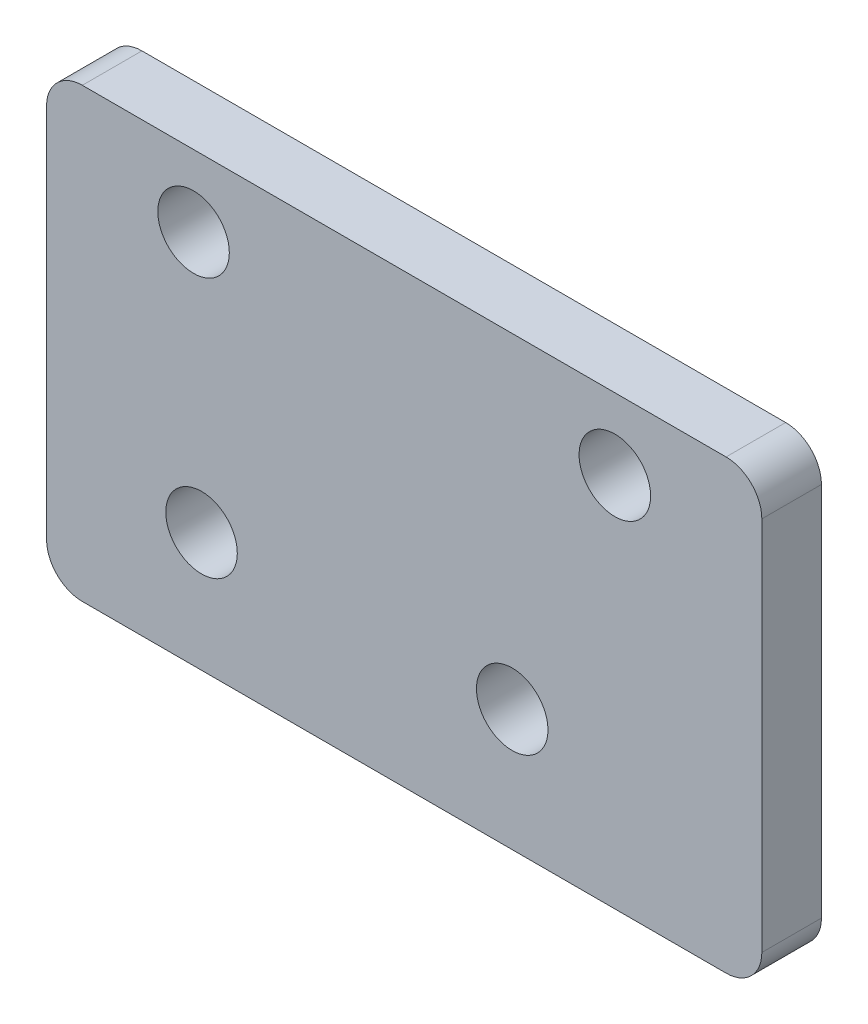
ISO-10303-21;
HEADER;
FILE_DESCRIPTION(('STEP AP214'),'2;1');
FILE_NAME('part.step','',(''),(''),'','','');
FILE_SCHEMA(('AUTOMOTIVE_DESIGN { 1 0 10303 214 1 1 1 1 }'));
ENDSEC;
DATA;
#1=APPLICATION_CONTEXT('core data for automotive mechanical design processes');
#2=APPLICATION_PROTOCOL_DEFINITION('international standard','automotive_design',2000,#1);
#3=PRODUCT_CONTEXT('',#1,'mechanical');
#4=PRODUCT('Part','Part','',(#3));
#5=PRODUCT_RELATED_PRODUCT_CATEGORY('part','',(#4));
#6=PRODUCT_DEFINITION_FORMATION('','',#4);
#7=PRODUCT_DEFINITION_CONTEXT('part definition',#1,'design');
#8=PRODUCT_DEFINITION('design','',#6,#7);
#9=PRODUCT_DEFINITION_SHAPE('','',#8);
#10=(LENGTH_UNIT() NAMED_UNIT(*) SI_UNIT(.MILLI.,.METRE.));
#11=(NAMED_UNIT(*) PLANE_ANGLE_UNIT() SI_UNIT($,.RADIAN.));
#12=(NAMED_UNIT(*) SI_UNIT($,.STERADIAN.) SOLID_ANGLE_UNIT());
#13=UNCERTAINTY_MEASURE_WITH_UNIT(LENGTH_MEASURE(1.E-05),#10,'distance_accuracy_value','');
#14=(GEOMETRIC_REPRESENTATION_CONTEXT(3) GLOBAL_UNCERTAINTY_ASSIGNED_CONTEXT((#13)) GLOBAL_UNIT_ASSIGNED_CONTEXT((#10,
#11,#12)) REPRESENTATION_CONTEXT('',''));
#15=CARTESIAN_POINT('',(0.,0.,0.));
#16=DIRECTION('',(0.,0.,1.));
#17=DIRECTION('',(1.,0.,0.));
#18=AXIS2_PLACEMENT_3D('',#15,#16,#17);
#19=CARTESIAN_POINT('',(38.5,-6.99999999999999,5.));
#20=DIRECTION('',(0.,0.,-1.));
#21=DIRECTION('',(-1.,0.,0.));
#22=AXIS2_PLACEMENT_3D('',#19,#20,#21);
#23=CYLINDRICAL_SURFACE('',#22,3.);
#24=CARTESIAN_POINT('',(38.5,-6.99999999999999,0.));
#25=DIRECTION('',(0.,0.,1.));
#26=DIRECTION('',(1.,0.,0.));
#27=AXIS2_PLACEMENT_3D('',#24,#25,#26);
#28=CIRCLE('',#27,3.);
#29=CARTESIAN_POINT('',(38.5,-9.99999999999999,0.));
#30=VERTEX_POINT('',#29);
#31=CARTESIAN_POINT('',(41.5,-6.99999999999997,0.));
#32=VERTEX_POINT('',#31);
#33=EDGE_CURVE('E139',#30,#32,#28,.T.);
#34=ORIENTED_EDGE('',*,*,#33,.T.);
#35=DIRECTION('',(0.,0.,-1.));
#36=VECTOR('',#35,1.);
#37=CARTESIAN_POINT('',(41.5,-6.99999999999997,5.));
#38=LINE('',#37,#36);
#39=CARTESIAN_POINT('',(41.5,-6.99999999999997,5.));
#40=VERTEX_POINT('',#39);
#41=EDGE_CURVE('E49',#40,#32,#38,.T.);
#42=ORIENTED_EDGE('',*,*,#41,.F.);
#43=CARTESIAN_POINT('',(38.5,-6.99999999999999,5.));
#44=DIRECTION('',(0.,0.,1.));
#45=DIRECTION('',(1.,0.,0.));
#46=AXIS2_PLACEMENT_3D('',#43,#44,#45);
#47=CIRCLE('',#46,3.);
#48=CARTESIAN_POINT('',(38.5,-9.99999999999999,5.));
#49=VERTEX_POINT('',#48);
#50=EDGE_CURVE('E186',#49,#40,#47,.T.);
#51=ORIENTED_EDGE('',*,*,#50,.F.);
#52=DIRECTION('',(0.,0.,-1.));
#53=VECTOR('',#52,1.);
#54=CARTESIAN_POINT('',(38.5,-9.99999999999999,5.));
#55=LINE('',#54,#53);
#56=EDGE_CURVE('E11',#49,#30,#55,.T.);
#57=ORIENTED_EDGE('',*,*,#56,.T.);
#58=EDGE_LOOP('',(#34,#42,#51,#57));
#59=FACE_BOUND('',#58,.T.);
#60=ADVANCED_FACE('F41',(#59),#23,.T.);
#61=CARTESIAN_POINT('',(41.5,24.5,5.));
#62=DIRECTION('',(-1.,0.,0.));
#63=DIRECTION('',(0.,-1.,0.));
#64=AXIS2_PLACEMENT_3D('',#61,#62,#63);
#65=PLANE('',#64);
#66=DIRECTION('',(0.,1.,0.));
#67=VECTOR('',#66,1.);
#68=CARTESIAN_POINT('',(41.5,24.5,0.));
#69=LINE('',#68,#67);
#70=CARTESIAN_POINT('',(41.5,24.5,0.));
#71=VERTEX_POINT('',#70);
#72=EDGE_CURVE('E145',#32,#71,#69,.T.);
#73=ORIENTED_EDGE('',*,*,#72,.T.);
#74=DIRECTION('',(0.,0.,-1.));
#75=VECTOR('',#74,1.);
#76=CARTESIAN_POINT('',(41.5,24.5,5.));
#77=LINE('',#76,#75);
#78=CARTESIAN_POINT('',(41.5,24.5,5.));
#79=VERTEX_POINT('',#78);
#80=EDGE_CURVE('E159',#79,#71,#77,.T.);
#81=ORIENTED_EDGE('',*,*,#80,.F.);
#82=DIRECTION('',(0.,1.,0.));
#83=VECTOR('',#82,1.);
#84=CARTESIAN_POINT('',(41.5,24.5,5.));
#85=LINE('',#84,#83);
#86=EDGE_CURVE('E194',#40,#79,#85,.T.);
#87=ORIENTED_EDGE('',*,*,#86,.F.);
#88=ORIENTED_EDGE('',*,*,#41,.T.);
#89=EDGE_LOOP('',(#73,#81,#87,#88));
#90=FACE_BOUND('',#89,.T.);
#91=ADVANCED_FACE('F213',(#90),#65,.F.);
#92=CARTESIAN_POINT('',(38.5,24.5,5.));
#93=DIRECTION('',(0.,0.,-1.));
#94=DIRECTION('',(-1.,0.,0.));
#95=AXIS2_PLACEMENT_3D('',#92,#93,#94);
#96=CYLINDRICAL_SURFACE('',#95,3.);
#97=CARTESIAN_POINT('',(38.5,24.5,0.));
#98=DIRECTION('',(0.,0.,1.));
#99=DIRECTION('',(-1.,0.,0.));
#100=AXIS2_PLACEMENT_3D('',#97,#98,#99);
#101=CIRCLE('',#100,3.);
#102=CARTESIAN_POINT('',(38.5,27.5,0.));
#103=VERTEX_POINT('',#102);
#104=EDGE_CURVE('E143',#71,#103,#101,.T.);
#105=ORIENTED_EDGE('',*,*,#104,.T.);
#106=DIRECTION('',(0.,0.,-1.));
#107=VECTOR('',#106,1.);
#108=CARTESIAN_POINT('',(38.5,27.5,5.));
#109=LINE('',#108,#107);
#110=CARTESIAN_POINT('',(38.5,27.5,5.));
#111=VERTEX_POINT('',#110);
#112=EDGE_CURVE('E160',#111,#103,#109,.T.);
#113=ORIENTED_EDGE('',*,*,#112,.F.);
#114=CARTESIAN_POINT('',(38.5,24.5,5.));
#115=DIRECTION('',(0.,0.,1.));
#116=DIRECTION('',(-1.,0.,0.));
#117=AXIS2_PLACEMENT_3D('',#114,#115,#116);
#118=CIRCLE('',#117,3.);
#119=EDGE_CURVE('E195',#79,#111,#118,.T.);
#120=ORIENTED_EDGE('',*,*,#119,.F.);
#121=ORIENTED_EDGE('',*,*,#80,.T.);
#122=EDGE_LOOP('',(#105,#113,#120,#121));
#123=FACE_BOUND('',#122,.T.);
#124=ADVANCED_FACE('F199',(#123),#96,.T.);
#125=CARTESIAN_POINT('',(-15.5,27.5,5.));
#126=DIRECTION('',(0.,-1.,0.));
#127=DIRECTION('',(1.,0.,0.));
#128=AXIS2_PLACEMENT_3D('',#125,#126,#127);
#129=PLANE('',#128);
#130=DIRECTION('',(-1.,0.,0.));
#131=VECTOR('',#130,1.);
#132=CARTESIAN_POINT('',(-15.5,27.5,0.));
#133=LINE('',#132,#131);
#134=CARTESIAN_POINT('',(-15.5,27.5,0.));
#135=VERTEX_POINT('',#134);
#136=EDGE_CURVE('E146',#103,#135,#133,.T.);
#137=ORIENTED_EDGE('',*,*,#136,.T.);
#138=DIRECTION('',(0.,0.,-1.));
#139=VECTOR('',#138,1.);
#140=CARTESIAN_POINT('',(-15.5,27.5,5.));
#141=LINE('',#140,#139);
#142=CARTESIAN_POINT('',(-15.5,27.5,5.));
#143=VERTEX_POINT('',#142);
#144=EDGE_CURVE('E128',#143,#135,#141,.T.);
#145=ORIENTED_EDGE('',*,*,#144,.F.);
#146=DIRECTION('',(-1.,0.,0.));
#147=VECTOR('',#146,1.);
#148=CARTESIAN_POINT('',(-15.5,27.5,5.));
#149=LINE('',#148,#147);
#150=EDGE_CURVE('E119',#111,#143,#149,.T.);
#151=ORIENTED_EDGE('',*,*,#150,.F.);
#152=ORIENTED_EDGE('',*,*,#112,.T.);
#153=EDGE_LOOP('',(#137,#145,#151,#152));
#154=FACE_BOUND('',#153,.T.);
#155=ADVANCED_FACE('F203',(#154),#129,.F.);
#156=CARTESIAN_POINT('',(-15.5,24.5,5.));
#157=DIRECTION('',(0.,0.,-1.));
#158=DIRECTION('',(-1.,0.,0.));
#159=AXIS2_PLACEMENT_3D('',#156,#157,#158);
#160=CYLINDRICAL_SURFACE('',#159,3.);
#161=CARTESIAN_POINT('',(-15.5,24.5,0.));
#162=DIRECTION('',(0.,0.,1.));
#163=DIRECTION('',(1.,0.,0.));
#164=AXIS2_PLACEMENT_3D('',#161,#162,#163);
#165=CIRCLE('',#164,3.);
#166=CARTESIAN_POINT('',(-18.5,24.5,0.));
#167=VERTEX_POINT('',#166);
#168=EDGE_CURVE('E130',#135,#167,#165,.T.);
#169=ORIENTED_EDGE('',*,*,#168,.T.);
#170=DIRECTION('',(0.,0.,-1.));
#171=VECTOR('',#170,1.);
#172=CARTESIAN_POINT('',(-18.5,24.5,5.));
#173=LINE('',#172,#171);
#174=CARTESIAN_POINT('',(-18.5,24.5,5.));
#175=VERTEX_POINT('',#174);
#176=EDGE_CURVE('E123',#175,#167,#173,.T.);
#177=ORIENTED_EDGE('',*,*,#176,.F.);
#178=CARTESIAN_POINT('',(-15.5,24.5,5.));
#179=DIRECTION('',(0.,0.,1.));
#180=DIRECTION('',(1.,0.,0.));
#181=AXIS2_PLACEMENT_3D('',#178,#179,#180);
#182=CIRCLE('',#181,3.);
#183=EDGE_CURVE('E112',#143,#175,#182,.T.);
#184=ORIENTED_EDGE('',*,*,#183,.F.);
#185=ORIENTED_EDGE('',*,*,#144,.T.);
#186=EDGE_LOOP('',(#169,#177,#184,#185));
#187=FACE_BOUND('',#186,.T.);
#188=ADVANCED_FACE('F129',(#187),#160,.T.);
#189=CARTESIAN_POINT('',(-18.5,24.5,5.));
#190=DIRECTION('',(1.,0.,0.));
#191=DIRECTION('',(0.,1.,0.));
#192=AXIS2_PLACEMENT_3D('',#189,#190,#191);
#193=PLANE('',#192);
#194=DIRECTION('',(0.,-1.,0.));
#195=VECTOR('',#194,1.);
#196=CARTESIAN_POINT('',(-18.5,24.5,0.));
#197=LINE('',#196,#195);
#198=CARTESIAN_POINT('',(-18.5,-6.99999999999998,0.));
#199=VERTEX_POINT('',#198);
#200=EDGE_CURVE('E89',#167,#199,#197,.T.);
#201=ORIENTED_EDGE('',*,*,#200,.T.);
#202=DIRECTION('',(0.,0.,-1.));
#203=VECTOR('',#202,1.);
#204=CARTESIAN_POINT('',(-18.5,-6.99999999999998,5.));
#205=LINE('',#204,#203);
#206=CARTESIAN_POINT('',(-18.5,-6.99999999999998,5.));
#207=VERTEX_POINT('',#206);
#208=EDGE_CURVE('E127',#207,#199,#205,.T.);
#209=ORIENTED_EDGE('',*,*,#208,.F.);
#210=DIRECTION('',(0.,-1.,0.));
#211=VECTOR('',#210,1.);
#212=CARTESIAN_POINT('',(-18.5,24.5,5.));
#213=LINE('',#212,#211);
#214=EDGE_CURVE('E117',#175,#207,#213,.T.);
#215=ORIENTED_EDGE('',*,*,#214,.F.);
#216=ORIENTED_EDGE('',*,*,#176,.T.);
#217=EDGE_LOOP('',(#201,#209,#215,#216));
#218=FACE_BOUND('',#217,.T.);
#219=ADVANCED_FACE('F135',(#218),#193,.F.);
#220=CARTESIAN_POINT('',(-15.5,-7.,5.));
#221=DIRECTION('',(0.,0.,-1.));
#222=DIRECTION('',(-1.,0.,0.));
#223=AXIS2_PLACEMENT_3D('',#220,#221,#222);
#224=CYLINDRICAL_SURFACE('',#223,3.);
#225=CARTESIAN_POINT('',(-15.5,-7.,0.));
#226=DIRECTION('',(0.,0.,1.));
#227=DIRECTION('',(1.,0.,0.));
#228=AXIS2_PLACEMENT_3D('',#225,#226,#227);
#229=CIRCLE('',#228,3.);
#230=CARTESIAN_POINT('',(-15.5,-10.,0.));
#231=VERTEX_POINT('',#230);
#232=EDGE_CURVE('E152',#199,#231,#229,.T.);
#233=ORIENTED_EDGE('',*,*,#232,.T.);
#234=DIRECTION('',(0.,0.,-1.));
#235=VECTOR('',#234,1.);
#236=CARTESIAN_POINT('',(-15.5,-10.,5.));
#237=LINE('',#236,#235);
#238=CARTESIAN_POINT('',(-15.5,-10.,5.));
#239=VERTEX_POINT('',#238);
#240=EDGE_CURVE('E136',#239,#231,#237,.T.);
#241=ORIENTED_EDGE('',*,*,#240,.F.);
#242=CARTESIAN_POINT('',(-15.5,-7.,5.));
#243=DIRECTION('',(0.,0.,1.));
#244=DIRECTION('',(1.,0.,0.));
#245=AXIS2_PLACEMENT_3D('',#242,#243,#244);
#246=CIRCLE('',#245,3.);
#247=EDGE_CURVE('E134',#207,#239,#246,.T.);
#248=ORIENTED_EDGE('',*,*,#247,.F.);
#249=ORIENTED_EDGE('',*,*,#208,.T.);
#250=EDGE_LOOP('',(#233,#241,#248,#249));
#251=FACE_BOUND('',#250,.T.);
#252=ADVANCED_FACE('F210',(#251),#224,.T.);
#253=CARTESIAN_POINT('',(31.175,-9.99999999999999,5.));
#254=DIRECTION('',(0.,1.,0.));
#255=DIRECTION('',(-1.,0.,0.));
#256=AXIS2_PLACEMENT_3D('',#253,#254,#255);
#257=PLANE('',#256);
#258=DIRECTION('',(1.,0.,0.));
#259=VECTOR('',#258,1.);
#260=CARTESIAN_POINT('',(31.175,-9.99999999999999,0.));
#261=LINE('',#260,#259);
#262=EDGE_CURVE('E98',#231,#30,#261,.T.);
#263=ORIENTED_EDGE('',*,*,#262,.T.);
#264=ORIENTED_EDGE('',*,*,#56,.F.);
#265=DIRECTION('',(1.,0.,0.));
#266=VECTOR('',#265,1.);
#267=CARTESIAN_POINT('',(33.3,-9.99999999999999,5.));
#268=LINE('',#267,#266);
#269=EDGE_CURVE('E56',#239,#49,#268,.T.);
#270=ORIENTED_EDGE('',*,*,#269,.F.);
#271=ORIENTED_EDGE('',*,*,#240,.T.);
#272=EDGE_LOOP('',(#263,#264,#270,#271));
#273=FACE_BOUND('',#272,.T.);
#274=ADVANCED_FACE('F206',(#273),#257,.F.);
#275=CARTESIAN_POINT('',(-15.5,-7.,5.));
#276=DIRECTION('',(0.,0.,1.));
#277=DIRECTION('',(1.,0.,0.));
#278=AXIS2_PLACEMENT_3D('',#275,#276,#277);
#279=PLANE('',#278);
#280=CARTESIAN_POINT('',(20.5600000000002,0.199999999999825,5.));
#281=DIRECTION('',(0.,0.,1.));
#282=DIRECTION('',(1.,0.,0.));
#283=AXIS2_PLACEMENT_3D('',#280,#281,#282);
#284=CIRCLE('',#283,3.);
#285=CARTESIAN_POINT('',(23.5600000000002,0.199999999999825,5.));
#286=VERTEX_POINT('',#285);
#287=EDGE_CURVE('E182',#286,#286,#284,.T.);
#288=ORIENTED_EDGE('',*,*,#287,.F.);
#289=EDGE_LOOP('',(#288));
#290=FACE_BOUND('',#289,.T.);
#291=CARTESIAN_POINT('',(-5.5,0.,5.));
#292=DIRECTION('',(0.,0.,1.));
#293=DIRECTION('',(1.,0.,0.));
#294=AXIS2_PLACEMENT_3D('',#291,#292,#293);
#295=CIRCLE('',#294,3.);
#296=CARTESIAN_POINT('',(-2.5,0.,5.));
#297=VERTEX_POINT('',#296);
#298=EDGE_CURVE('E173',#297,#297,#295,.T.);
#299=ORIENTED_EDGE('',*,*,#298,.F.);
#300=EDGE_LOOP('',(#299));
#301=FACE_BOUND('',#300,.T.);
#302=CARTESIAN_POINT('',(-6.17,21.5,5.));
#303=DIRECTION('',(0.,0.,1.));
#304=DIRECTION('',(1.,0.,0.));
#305=AXIS2_PLACEMENT_3D('',#302,#303,#304);
#306=CIRCLE('',#305,3.);
#307=CARTESIAN_POINT('',(-3.17,21.5,5.));
#308=VERTEX_POINT('',#307);
#309=EDGE_CURVE('E166',#308,#308,#306,.T.);
#310=ORIENTED_EDGE('',*,*,#309,.F.);
#311=EDGE_LOOP('',(#310));
#312=FACE_BOUND('',#311,.T.);
#313=CARTESIAN_POINT('',(29.17,21.5,5.));
#314=DIRECTION('',(0.,0.,1.));
#315=DIRECTION('',(1.,0.,0.));
#316=AXIS2_PLACEMENT_3D('',#313,#314,#315);
#317=CIRCLE('',#316,3.);
#318=CARTESIAN_POINT('',(32.17,21.5,5.));
#319=VERTEX_POINT('',#318);
#320=EDGE_CURVE('E175',#319,#319,#317,.T.);
#321=ORIENTED_EDGE('',*,*,#320,.F.);
#322=EDGE_LOOP('',(#321));
#323=FACE_BOUND('',#322,.T.);
#324=ORIENTED_EDGE('',*,*,#269,.T.);
#325=ORIENTED_EDGE('',*,*,#50,.T.);
#326=ORIENTED_EDGE('',*,*,#86,.T.);
#327=ORIENTED_EDGE('',*,*,#119,.T.);
#328=ORIENTED_EDGE('',*,*,#150,.T.);
#329=ORIENTED_EDGE('',*,*,#183,.T.);
#330=ORIENTED_EDGE('',*,*,#214,.T.);
#331=ORIENTED_EDGE('',*,*,#247,.T.);
#332=EDGE_LOOP('',(#324,#325,#326,#327,#328,#329,#330,#331));
#333=FACE_BOUND('',#332,.T.);
#334=ADVANCED_FACE('F116',(#290,#301,#312,#323,#333),#279,.T.);
#335=CARTESIAN_POINT('',(-15.5,-7.,0.));
#336=DIRECTION('',(0.,0.,1.));
#337=DIRECTION('',(1.,0.,0.));
#338=AXIS2_PLACEMENT_3D('',#335,#336,#337);
#339=PLANE('',#338);
#340=CARTESIAN_POINT('',(20.5600000000002,0.199999999999825,0.));
#341=DIRECTION('',(0.,0.,1.));
#342=DIRECTION('',(1.,0.,0.));
#343=AXIS2_PLACEMENT_3D('',#340,#341,#342);
#344=CIRCLE('',#343,3.);
#345=CARTESIAN_POINT('',(23.5600000000002,0.199999999999825,0.));
#346=VERTEX_POINT('',#345);
#347=EDGE_CURVE('E42',#346,#346,#344,.T.);
#348=ORIENTED_EDGE('',*,*,#347,.T.);
#349=EDGE_LOOP('',(#348));
#350=FACE_BOUND('',#349,.T.);
#351=CARTESIAN_POINT('',(-5.5,0.,0.));
#352=DIRECTION('',(0.,0.,1.));
#353=DIRECTION('',(1.,0.,0.));
#354=AXIS2_PLACEMENT_3D('',#351,#352,#353);
#355=CIRCLE('',#354,3.);
#356=CARTESIAN_POINT('',(-2.5,0.,0.));
#357=VERTEX_POINT('',#356);
#358=EDGE_CURVE('E167',#357,#357,#355,.T.);
#359=ORIENTED_EDGE('',*,*,#358,.T.);
#360=EDGE_LOOP('',(#359));
#361=FACE_BOUND('',#360,.T.);
#362=CARTESIAN_POINT('',(-6.17,21.5,0.));
#363=DIRECTION('',(0.,0.,1.));
#364=DIRECTION('',(1.,0.,0.));
#365=AXIS2_PLACEMENT_3D('',#362,#363,#364);
#366=CIRCLE('',#365,3.);
#367=CARTESIAN_POINT('',(-3.17,21.5,0.));
#368=VERTEX_POINT('',#367);
#369=EDGE_CURVE('E141',#368,#368,#366,.T.);
#370=ORIENTED_EDGE('',*,*,#369,.T.);
#371=EDGE_LOOP('',(#370));
#372=FACE_BOUND('',#371,.T.);
#373=CARTESIAN_POINT('',(29.17,21.5,0.));
#374=DIRECTION('',(0.,0.,1.));
#375=DIRECTION('',(1.,0.,0.));
#376=AXIS2_PLACEMENT_3D('',#373,#374,#375);
#377=CIRCLE('',#376,3.);
#378=CARTESIAN_POINT('',(32.17,21.5,0.));
#379=VERTEX_POINT('',#378);
#380=EDGE_CURVE('E164',#379,#379,#377,.T.);
#381=ORIENTED_EDGE('',*,*,#380,.T.);
#382=EDGE_LOOP('',(#381));
#383=FACE_BOUND('',#382,.T.);
#384=ORIENTED_EDGE('',*,*,#33,.F.);
#385=ORIENTED_EDGE('',*,*,#262,.F.);
#386=ORIENTED_EDGE('',*,*,#232,.F.);
#387=ORIENTED_EDGE('',*,*,#200,.F.);
#388=ORIENTED_EDGE('',*,*,#168,.F.);
#389=ORIENTED_EDGE('',*,*,#136,.F.);
#390=ORIENTED_EDGE('',*,*,#104,.F.);
#391=ORIENTED_EDGE('',*,*,#72,.F.);
#392=EDGE_LOOP('',(#384,#385,#386,#387,#388,#389,#390,#391));
#393=FACE_BOUND('',#392,.T.);
#394=ADVANCED_FACE('F202',(#350,#361,#372,#383,#393),#339,.F.);
#395=CARTESIAN_POINT('',(29.17,21.5,-5.));
#396=DIRECTION('',(0.,0.,1.));
#397=DIRECTION('',(1.,0.,0.));
#398=AXIS2_PLACEMENT_3D('',#395,#396,#397);
#399=CYLINDRICAL_SURFACE('',#398,3.);
#400=ORIENTED_EDGE('',*,*,#320,.T.);
#401=EDGE_LOOP('',(#400));
#402=FACE_BOUND('',#401,.T.);
#403=ORIENTED_EDGE('',*,*,#380,.F.);
#404=EDGE_LOOP('',(#403));
#405=FACE_BOUND('',#404,.T.);
#406=ADVANCED_FACE('F234',(#402,#405),#399,.F.);
#407=CARTESIAN_POINT('',(-6.17,21.5,-5.));
#408=DIRECTION('',(0.,0.,1.));
#409=DIRECTION('',(1.,0.,0.));
#410=AXIS2_PLACEMENT_3D('',#407,#408,#409);
#411=CYLINDRICAL_SURFACE('',#410,3.);
#412=ORIENTED_EDGE('',*,*,#309,.T.);
#413=EDGE_LOOP('',(#412));
#414=FACE_BOUND('',#413,.T.);
#415=ORIENTED_EDGE('',*,*,#369,.F.);
#416=EDGE_LOOP('',(#415));
#417=FACE_BOUND('',#416,.T.);
#418=ADVANCED_FACE('F241',(#414,#417),#411,.F.);
#419=CARTESIAN_POINT('',(-5.5,0.,-5.));
#420=DIRECTION('',(0.,0.,1.));
#421=DIRECTION('',(1.,0.,0.));
#422=AXIS2_PLACEMENT_3D('',#419,#420,#421);
#423=CYLINDRICAL_SURFACE('',#422,3.);
#424=ORIENTED_EDGE('',*,*,#298,.T.);
#425=EDGE_LOOP('',(#424));
#426=FACE_BOUND('',#425,.T.);
#427=ORIENTED_EDGE('',*,*,#358,.F.);
#428=EDGE_LOOP('',(#427));
#429=FACE_BOUND('',#428,.T.);
#430=ADVANCED_FACE('F244',(#426,#429),#423,.F.);
#431=CARTESIAN_POINT('',(20.5600000000002,0.199999999999825,-5.));
#432=DIRECTION('',(0.,0.,1.));
#433=DIRECTION('',(1.,0.,0.));
#434=AXIS2_PLACEMENT_3D('',#431,#432,#433);
#435=CYLINDRICAL_SURFACE('',#434,3.);
#436=ORIENTED_EDGE('',*,*,#287,.T.);
#437=EDGE_LOOP('',(#436));
#438=FACE_BOUND('',#437,.T.);
#439=ORIENTED_EDGE('',*,*,#347,.F.);
#440=EDGE_LOOP('',(#439));
#441=FACE_BOUND('',#440,.T.);
#442=ADVANCED_FACE('F248',(#438,#441),#435,.F.);
#443=CLOSED_SHELL('',(#60,#91,#124,#155,#188,#219,#252,#274,#334,#394,#406,#418,#430,#442));
#444=MANIFOLD_SOLID_BREP('B2',#443);
#445=ADVANCED_BREP_SHAPE_REPRESENTATION('',(#18,#444),#14);
#446=SHAPE_DEFINITION_REPRESENTATION(#9,#445);
ENDSEC;
END-ISO-10303-21;
